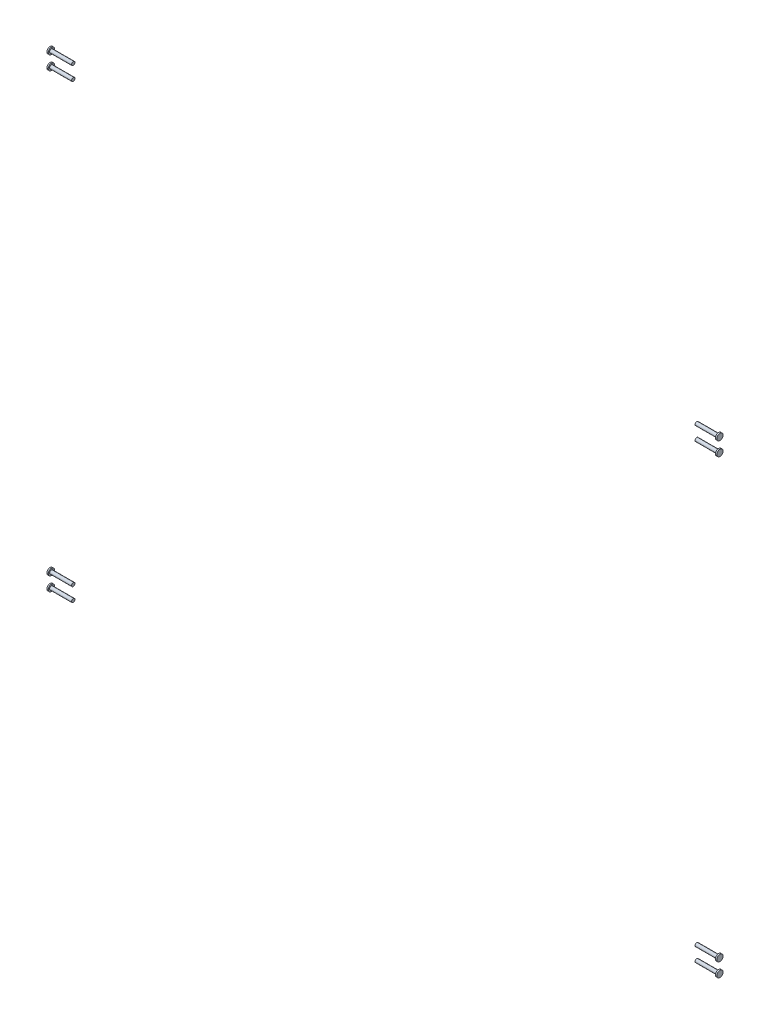
ISO-10303-21;
HEADER;
FILE_DESCRIPTION(('STEP AP214'),'2;1');
FILE_NAME('part.step','',(''),(''),'','','');
FILE_SCHEMA(('AUTOMOTIVE_DESIGN { 1 0 10303 214 1 1 1 1 }'));
ENDSEC;
DATA;
#1=APPLICATION_CONTEXT('core data for automotive mechanical design processes');
#2=APPLICATION_PROTOCOL_DEFINITION('international standard','automotive_design',2000,#1);
#3=PRODUCT_CONTEXT('',#1,'mechanical');
#4=PRODUCT('Part','Part','',(#3));
#5=PRODUCT_RELATED_PRODUCT_CATEGORY('part','',(#4));
#6=PRODUCT_DEFINITION_FORMATION('','',#4);
#7=PRODUCT_DEFINITION_CONTEXT('part definition',#1,'design');
#8=PRODUCT_DEFINITION('design','',#6,#7);
#9=PRODUCT_DEFINITION_SHAPE('','',#8);
#10=(LENGTH_UNIT() NAMED_UNIT(*) SI_UNIT(.MILLI.,.METRE.));
#11=(NAMED_UNIT(*) PLANE_ANGLE_UNIT() SI_UNIT($,.RADIAN.));
#12=(NAMED_UNIT(*) SI_UNIT($,.STERADIAN.) SOLID_ANGLE_UNIT());
#13=UNCERTAINTY_MEASURE_WITH_UNIT(LENGTH_MEASURE(1.E-05),#10,'distance_accuracy_value','');
#14=(GEOMETRIC_REPRESENTATION_CONTEXT(3) GLOBAL_UNCERTAINTY_ASSIGNED_CONTEXT((#13)) GLOBAL_UNIT_ASSIGNED_CONTEXT((#10,
#11,#12)) REPRESENTATION_CONTEXT('',''));
#15=CARTESIAN_POINT('',(0.,0.,0.));
#16=DIRECTION('',(0.,0.,1.));
#17=DIRECTION('',(1.,0.,0.));
#18=AXIS2_PLACEMENT_3D('',#15,#16,#17);
#19=CARTESIAN_POINT('',(-270.8,-202.,24.));
#20=DIRECTION('',(1.,0.,0.));
#21=DIRECTION('',(0.,0.,-1.));
#22=AXIS2_PLACEMENT_3D('',#19,#20,#21);
#23=PLANE('',#22);
#24=CARTESIAN_POINT('',(-270.8,-202.,24.));
#25=DIRECTION('',(-1.,0.,0.));
#26=DIRECTION('',(0.,0.,1.));
#27=AXIS2_PLACEMENT_3D('',#24,#25,#26);
#28=CIRCLE('',#27,1.5);
#29=CARTESIAN_POINT('',(-270.8,-202.,25.5));
#30=VERTEX_POINT('',#29);
#31=EDGE_CURVE('P0_E10',#30,#30,#28,.T.);
#32=ORIENTED_EDGE('',*,*,#31,.F.);
#33=EDGE_LOOP('',(#32));
#34=FACE_BOUND('',#33,.T.);
#35=ADVANCED_FACE('P0_F15',(#34),#23,.T.);
#36=CARTESIAN_POINT('',(-270.8,-202.,24.));
#37=DIRECTION('',(-1.,0.,0.));
#38=DIRECTION('',(0.,0.,1.));
#39=AXIS2_PLACEMENT_3D('',#36,#37,#38);
#40=CYLINDRICAL_SURFACE('',#39,1.5);
#41=CARTESIAN_POINT('',(-289.8,-202.,24.));
#42=DIRECTION('',(1.,0.,0.));
#43=DIRECTION('',(0.,0.,-1.));
#44=AXIS2_PLACEMENT_3D('',#41,#42,#43);
#45=CIRCLE('',#44,1.5);
#46=CARTESIAN_POINT('',(-289.8,-202.,22.5));
#47=VERTEX_POINT('',#46);
#48=EDGE_CURVE('P0_E23',#47,#47,#45,.F.);
#49=ORIENTED_EDGE('',*,*,#48,.F.);
#50=EDGE_LOOP('',(#49));
#51=FACE_BOUND('',#50,.T.);
#52=ORIENTED_EDGE('',*,*,#31,.T.);
#53=EDGE_LOOP('',(#52));
#54=FACE_BOUND('',#53,.T.);
#55=ADVANCED_FACE('P0_F17',(#51,#54),#40,.T.);
#56=CARTESIAN_POINT('',(-291.,-202.,24.));
#57=DIRECTION('',(-1.,0.,0.));
#58=DIRECTION('',(0.,0.,1.));
#59=AXIS2_PLACEMENT_3D('',#56,#57,#58);
#60=PLANE('',#59);
#61=CARTESIAN_POINT('',(-291.,-202.,24.));
#62=DIRECTION('',(1.,0.,0.));
#63=DIRECTION('',(0.,0.,-1.));
#64=AXIS2_PLACEMENT_3D('',#61,#62,#63);
#65=CIRCLE('',#64,2.75);
#66=CARTESIAN_POINT('',(-291.,-202.,21.25));
#67=VERTEX_POINT('',#66);
#68=EDGE_CURVE('P0_E30',#67,#67,#65,.T.);
#69=ORIENTED_EDGE('',*,*,#68,.F.);
#70=EDGE_LOOP('',(#69));
#71=FACE_BOUND('',#70,.T.);
#72=ADVANCED_FACE('P0_F45',(#71),#60,.T.);
#73=CARTESIAN_POINT('',(-289.8,-202.,24.));
#74=DIRECTION('',(1.,0.,0.));
#75=DIRECTION('',(0.,0.,-1.));
#76=AXIS2_PLACEMENT_3D('',#73,#74,#75);
#77=PLANE('',#76);
#78=ORIENTED_EDGE('',*,*,#48,.T.);
#79=EDGE_LOOP('',(#78));
#80=FACE_BOUND('',#79,.T.);
#81=CARTESIAN_POINT('',(-289.8,-202.,24.));
#82=DIRECTION('',(-1.,0.,0.));
#83=DIRECTION('',(0.,0.,1.));
#84=AXIS2_PLACEMENT_3D('',#81,#82,#83);
#85=CIRCLE('',#84,2.75);
#86=CARTESIAN_POINT('',(-289.8,-202.,26.75));
#87=VERTEX_POINT('',#86);
#88=EDGE_CURVE('P0_E35',#87,#87,#85,.T.);
#89=ORIENTED_EDGE('',*,*,#88,.F.);
#90=EDGE_LOOP('',(#89));
#91=FACE_BOUND('',#90,.T.);
#92=ADVANCED_FACE('P0_F43',(#80,#91),#77,.T.);
#93=CARTESIAN_POINT('',(-289.8,-202.,24.));
#94=DIRECTION('',(-1.,0.,0.));
#95=DIRECTION('',(0.,0.,1.));
#96=AXIS2_PLACEMENT_3D('',#93,#94,#95);
#97=CYLINDRICAL_SURFACE('',#96,2.75);
#98=ORIENTED_EDGE('',*,*,#68,.T.);
#99=EDGE_LOOP('',(#98));
#100=FACE_BOUND('',#99,.T.);
#101=ORIENTED_EDGE('',*,*,#88,.T.);
#102=EDGE_LOOP('',(#101));
#103=FACE_BOUND('',#102,.T.);
#104=ADVANCED_FACE('P0_F41',(#100,#103),#97,.T.);
#105=CLOSED_SHELL('',(#35,#55,#72,#92,#104));
#106=MANIFOLD_SOLID_BREP('P0_B1',#105);
#107=CARTESIAN_POINT('',(-270.8,-190.,24.));
#108=DIRECTION('',(1.,0.,0.));
#109=DIRECTION('',(0.,0.,-1.));
#110=AXIS2_PLACEMENT_3D('',#107,#108,#109);
#111=PLANE('',#110);
#112=CARTESIAN_POINT('',(-270.8,-190.,24.));
#113=DIRECTION('',(-1.,0.,0.));
#114=DIRECTION('',(0.,0.,1.));
#115=AXIS2_PLACEMENT_3D('',#112,#113,#114);
#116=CIRCLE('',#115,1.5);
#117=CARTESIAN_POINT('',(-270.8,-190.,25.5));
#118=VERTEX_POINT('',#117);
#119=EDGE_CURVE('P1_E10',#118,#118,#116,.T.);
#120=ORIENTED_EDGE('',*,*,#119,.F.);
#121=EDGE_LOOP('',(#120));
#122=FACE_BOUND('',#121,.T.);
#123=ADVANCED_FACE('P1_F15',(#122),#111,.T.);
#124=CARTESIAN_POINT('',(-270.8,-190.,24.));
#125=DIRECTION('',(-1.,0.,0.));
#126=DIRECTION('',(0.,0.,1.));
#127=AXIS2_PLACEMENT_3D('',#124,#125,#126);
#128=CYLINDRICAL_SURFACE('',#127,1.5);
#129=CARTESIAN_POINT('',(-289.8,-190.,24.));
#130=DIRECTION('',(1.,0.,0.));
#131=DIRECTION('',(0.,0.,-1.));
#132=AXIS2_PLACEMENT_3D('',#129,#130,#131);
#133=CIRCLE('',#132,1.5);
#134=CARTESIAN_POINT('',(-289.8,-190.,22.5));
#135=VERTEX_POINT('',#134);
#136=EDGE_CURVE('P1_E23',#135,#135,#133,.F.);
#137=ORIENTED_EDGE('',*,*,#136,.F.);
#138=EDGE_LOOP('',(#137));
#139=FACE_BOUND('',#138,.T.);
#140=ORIENTED_EDGE('',*,*,#119,.T.);
#141=EDGE_LOOP('',(#140));
#142=FACE_BOUND('',#141,.T.);
#143=ADVANCED_FACE('P1_F17',(#139,#142),#128,.T.);
#144=CARTESIAN_POINT('',(-291.,-190.,24.));
#145=DIRECTION('',(-1.,0.,0.));
#146=DIRECTION('',(0.,0.,1.));
#147=AXIS2_PLACEMENT_3D('',#144,#145,#146);
#148=PLANE('',#147);
#149=CARTESIAN_POINT('',(-291.,-190.,24.));
#150=DIRECTION('',(1.,0.,0.));
#151=DIRECTION('',(0.,0.,-1.));
#152=AXIS2_PLACEMENT_3D('',#149,#150,#151);
#153=CIRCLE('',#152,2.75);
#154=CARTESIAN_POINT('',(-291.,-190.,21.25));
#155=VERTEX_POINT('',#154);
#156=EDGE_CURVE('P1_E30',#155,#155,#153,.T.);
#157=ORIENTED_EDGE('',*,*,#156,.F.);
#158=EDGE_LOOP('',(#157));
#159=FACE_BOUND('',#158,.T.);
#160=ADVANCED_FACE('P1_F45',(#159),#148,.T.);
#161=CARTESIAN_POINT('',(-289.8,-190.,24.));
#162=DIRECTION('',(1.,0.,0.));
#163=DIRECTION('',(0.,0.,-1.));
#164=AXIS2_PLACEMENT_3D('',#161,#162,#163);
#165=PLANE('',#164);
#166=ORIENTED_EDGE('',*,*,#136,.T.);
#167=EDGE_LOOP('',(#166));
#168=FACE_BOUND('',#167,.T.);
#169=CARTESIAN_POINT('',(-289.8,-190.,24.));
#170=DIRECTION('',(-1.,0.,0.));
#171=DIRECTION('',(0.,0.,1.));
#172=AXIS2_PLACEMENT_3D('',#169,#170,#171);
#173=CIRCLE('',#172,2.75);
#174=CARTESIAN_POINT('',(-289.8,-190.,26.75));
#175=VERTEX_POINT('',#174);
#176=EDGE_CURVE('P1_E35',#175,#175,#173,.T.);
#177=ORIENTED_EDGE('',*,*,#176,.F.);
#178=EDGE_LOOP('',(#177));
#179=FACE_BOUND('',#178,.T.);
#180=ADVANCED_FACE('P1_F43',(#168,#179),#165,.T.);
#181=CARTESIAN_POINT('',(-289.8,-190.,24.));
#182=DIRECTION('',(-1.,0.,0.));
#183=DIRECTION('',(0.,0.,1.));
#184=AXIS2_PLACEMENT_3D('',#181,#182,#183);
#185=CYLINDRICAL_SURFACE('',#184,2.75);
#186=ORIENTED_EDGE('',*,*,#156,.T.);
#187=EDGE_LOOP('',(#186));
#188=FACE_BOUND('',#187,.T.);
#189=ORIENTED_EDGE('',*,*,#176,.T.);
#190=EDGE_LOOP('',(#189));
#191=FACE_BOUND('',#190,.T.);
#192=ADVANCED_FACE('P1_F41',(#188,#191),#185,.T.);
#193=CLOSED_SHELL('',(#123,#143,#160,#180,#192));
#194=MANIFOLD_SOLID_BREP('P1_B1',#193);
#195=CARTESIAN_POINT('',(-270.8,190.,24.));
#196=DIRECTION('',(1.,0.,0.));
#197=DIRECTION('',(0.,0.,-1.));
#198=AXIS2_PLACEMENT_3D('',#195,#196,#197);
#199=PLANE('',#198);
#200=CARTESIAN_POINT('',(-270.8,190.,24.));
#201=DIRECTION('',(-1.,0.,0.));
#202=DIRECTION('',(0.,0.,1.));
#203=AXIS2_PLACEMENT_3D('',#200,#201,#202);
#204=CIRCLE('',#203,1.5);
#205=CARTESIAN_POINT('',(-270.8,190.,25.5));
#206=VERTEX_POINT('',#205);
#207=EDGE_CURVE('P2_E10',#206,#206,#204,.T.);
#208=ORIENTED_EDGE('',*,*,#207,.F.);
#209=EDGE_LOOP('',(#208));
#210=FACE_BOUND('',#209,.T.);
#211=ADVANCED_FACE('P2_F15',(#210),#199,.T.);
#212=CARTESIAN_POINT('',(-270.8,190.,24.));
#213=DIRECTION('',(-1.,0.,0.));
#214=DIRECTION('',(0.,0.,1.));
#215=AXIS2_PLACEMENT_3D('',#212,#213,#214);
#216=CYLINDRICAL_SURFACE('',#215,1.5);
#217=CARTESIAN_POINT('',(-289.8,190.,24.));
#218=DIRECTION('',(1.,0.,0.));
#219=DIRECTION('',(0.,0.,-1.));
#220=AXIS2_PLACEMENT_3D('',#217,#218,#219);
#221=CIRCLE('',#220,1.5);
#222=CARTESIAN_POINT('',(-289.8,190.,22.5));
#223=VERTEX_POINT('',#222);
#224=EDGE_CURVE('P2_E23',#223,#223,#221,.F.);
#225=ORIENTED_EDGE('',*,*,#224,.F.);
#226=EDGE_LOOP('',(#225));
#227=FACE_BOUND('',#226,.T.);
#228=ORIENTED_EDGE('',*,*,#207,.T.);
#229=EDGE_LOOP('',(#228));
#230=FACE_BOUND('',#229,.T.);
#231=ADVANCED_FACE('P2_F17',(#227,#230),#216,.T.);
#232=CARTESIAN_POINT('',(-291.,190.,24.));
#233=DIRECTION('',(-1.,0.,0.));
#234=DIRECTION('',(0.,0.,1.));
#235=AXIS2_PLACEMENT_3D('',#232,#233,#234);
#236=PLANE('',#235);
#237=CARTESIAN_POINT('',(-291.,190.,24.));
#238=DIRECTION('',(1.,0.,0.));
#239=DIRECTION('',(0.,0.,-1.));
#240=AXIS2_PLACEMENT_3D('',#237,#238,#239);
#241=CIRCLE('',#240,2.75);
#242=CARTESIAN_POINT('',(-291.,190.,21.25));
#243=VERTEX_POINT('',#242);
#244=EDGE_CURVE('P2_E30',#243,#243,#241,.T.);
#245=ORIENTED_EDGE('',*,*,#244,.F.);
#246=EDGE_LOOP('',(#245));
#247=FACE_BOUND('',#246,.T.);
#248=ADVANCED_FACE('P2_F45',(#247),#236,.T.);
#249=CARTESIAN_POINT('',(-289.8,190.,24.));
#250=DIRECTION('',(1.,0.,0.));
#251=DIRECTION('',(0.,0.,-1.));
#252=AXIS2_PLACEMENT_3D('',#249,#250,#251);
#253=PLANE('',#252);
#254=ORIENTED_EDGE('',*,*,#224,.T.);
#255=EDGE_LOOP('',(#254));
#256=FACE_BOUND('',#255,.T.);
#257=CARTESIAN_POINT('',(-289.8,190.,24.));
#258=DIRECTION('',(-1.,0.,0.));
#259=DIRECTION('',(0.,0.,1.));
#260=AXIS2_PLACEMENT_3D('',#257,#258,#259);
#261=CIRCLE('',#260,2.75);
#262=CARTESIAN_POINT('',(-289.8,190.,26.75));
#263=VERTEX_POINT('',#262);
#264=EDGE_CURVE('P2_E35',#263,#263,#261,.T.);
#265=ORIENTED_EDGE('',*,*,#264,.F.);
#266=EDGE_LOOP('',(#265));
#267=FACE_BOUND('',#266,.T.);
#268=ADVANCED_FACE('P2_F43',(#256,#267),#253,.T.);
#269=CARTESIAN_POINT('',(-289.8,190.,24.));
#270=DIRECTION('',(-1.,0.,0.));
#271=DIRECTION('',(0.,0.,1.));
#272=AXIS2_PLACEMENT_3D('',#269,#270,#271);
#273=CYLINDRICAL_SURFACE('',#272,2.75);
#274=ORIENTED_EDGE('',*,*,#244,.T.);
#275=EDGE_LOOP('',(#274));
#276=FACE_BOUND('',#275,.T.);
#277=ORIENTED_EDGE('',*,*,#264,.T.);
#278=EDGE_LOOP('',(#277));
#279=FACE_BOUND('',#278,.T.);
#280=ADVANCED_FACE('P2_F41',(#276,#279),#273,.T.);
#281=CLOSED_SHELL('',(#211,#231,#248,#268,#280));
#282=MANIFOLD_SOLID_BREP('P2_B1',#281);
#283=CARTESIAN_POINT('',(-270.8,202.,24.));
#284=DIRECTION('',(1.,0.,0.));
#285=DIRECTION('',(0.,0.,-1.));
#286=AXIS2_PLACEMENT_3D('',#283,#284,#285);
#287=PLANE('',#286);
#288=CARTESIAN_POINT('',(-270.8,202.,24.));
#289=DIRECTION('',(-1.,0.,0.));
#290=DIRECTION('',(0.,0.,1.));
#291=AXIS2_PLACEMENT_3D('',#288,#289,#290);
#292=CIRCLE('',#291,1.5);
#293=CARTESIAN_POINT('',(-270.8,202.,25.5));
#294=VERTEX_POINT('',#293);
#295=EDGE_CURVE('P3_E10',#294,#294,#292,.T.);
#296=ORIENTED_EDGE('',*,*,#295,.F.);
#297=EDGE_LOOP('',(#296));
#298=FACE_BOUND('',#297,.T.);
#299=ADVANCED_FACE('P3_F15',(#298),#287,.T.);
#300=CARTESIAN_POINT('',(-270.8,202.,24.));
#301=DIRECTION('',(-1.,0.,0.));
#302=DIRECTION('',(0.,0.,1.));
#303=AXIS2_PLACEMENT_3D('',#300,#301,#302);
#304=CYLINDRICAL_SURFACE('',#303,1.5);
#305=CARTESIAN_POINT('',(-289.8,202.,24.));
#306=DIRECTION('',(1.,0.,0.));
#307=DIRECTION('',(0.,0.,-1.));
#308=AXIS2_PLACEMENT_3D('',#305,#306,#307);
#309=CIRCLE('',#308,1.5);
#310=CARTESIAN_POINT('',(-289.8,202.,22.5));
#311=VERTEX_POINT('',#310);
#312=EDGE_CURVE('P3_E23',#311,#311,#309,.F.);
#313=ORIENTED_EDGE('',*,*,#312,.F.);
#314=EDGE_LOOP('',(#313));
#315=FACE_BOUND('',#314,.T.);
#316=ORIENTED_EDGE('',*,*,#295,.T.);
#317=EDGE_LOOP('',(#316));
#318=FACE_BOUND('',#317,.T.);
#319=ADVANCED_FACE('P3_F17',(#315,#318),#304,.T.);
#320=CARTESIAN_POINT('',(-291.,202.,24.));
#321=DIRECTION('',(-1.,0.,0.));
#322=DIRECTION('',(0.,0.,1.));
#323=AXIS2_PLACEMENT_3D('',#320,#321,#322);
#324=PLANE('',#323);
#325=CARTESIAN_POINT('',(-291.,202.,24.));
#326=DIRECTION('',(1.,0.,0.));
#327=DIRECTION('',(0.,0.,-1.));
#328=AXIS2_PLACEMENT_3D('',#325,#326,#327);
#329=CIRCLE('',#328,2.75);
#330=CARTESIAN_POINT('',(-291.,202.,21.25));
#331=VERTEX_POINT('',#330);
#332=EDGE_CURVE('P3_E30',#331,#331,#329,.T.);
#333=ORIENTED_EDGE('',*,*,#332,.F.);
#334=EDGE_LOOP('',(#333));
#335=FACE_BOUND('',#334,.T.);
#336=ADVANCED_FACE('P3_F45',(#335),#324,.T.);
#337=CARTESIAN_POINT('',(-289.8,202.,24.));
#338=DIRECTION('',(1.,0.,0.));
#339=DIRECTION('',(0.,0.,-1.));
#340=AXIS2_PLACEMENT_3D('',#337,#338,#339);
#341=PLANE('',#340);
#342=ORIENTED_EDGE('',*,*,#312,.T.);
#343=EDGE_LOOP('',(#342));
#344=FACE_BOUND('',#343,.T.);
#345=CARTESIAN_POINT('',(-289.8,202.,24.));
#346=DIRECTION('',(-1.,0.,0.));
#347=DIRECTION('',(0.,0.,1.));
#348=AXIS2_PLACEMENT_3D('',#345,#346,#347);
#349=CIRCLE('',#348,2.75);
#350=CARTESIAN_POINT('',(-289.8,202.,26.75));
#351=VERTEX_POINT('',#350);
#352=EDGE_CURVE('P3_E35',#351,#351,#349,.T.);
#353=ORIENTED_EDGE('',*,*,#352,.F.);
#354=EDGE_LOOP('',(#353));
#355=FACE_BOUND('',#354,.T.);
#356=ADVANCED_FACE('P3_F43',(#344,#355),#341,.T.);
#357=CARTESIAN_POINT('',(-289.8,202.,24.));
#358=DIRECTION('',(-1.,0.,0.));
#359=DIRECTION('',(0.,0.,1.));
#360=AXIS2_PLACEMENT_3D('',#357,#358,#359);
#361=CYLINDRICAL_SURFACE('',#360,2.75);
#362=ORIENTED_EDGE('',*,*,#332,.T.);
#363=EDGE_LOOP('',(#362));
#364=FACE_BOUND('',#363,.T.);
#365=ORIENTED_EDGE('',*,*,#352,.T.);
#366=EDGE_LOOP('',(#365));
#367=FACE_BOUND('',#366,.T.);
#368=ADVANCED_FACE('P3_F41',(#364,#367),#361,.T.);
#369=CLOSED_SHELL('',(#299,#319,#336,#356,#368));
#370=MANIFOLD_SOLID_BREP('P3_B1',#369);
#371=CARTESIAN_POINT('',(270.8,-202.,24.));
#372=DIRECTION('',(-1.,0.,0.));
#373=DIRECTION('',(0.,0.,1.));
#374=AXIS2_PLACEMENT_3D('',#371,#372,#373);
#375=PLANE('',#374);
#376=CARTESIAN_POINT('',(270.8,-202.,24.));
#377=DIRECTION('',(1.,0.,0.));
#378=DIRECTION('',(0.,0.,-1.));
#379=AXIS2_PLACEMENT_3D('',#376,#377,#378);
#380=CIRCLE('',#379,1.5);
#381=CARTESIAN_POINT('',(270.8,-202.,22.5));
#382=VERTEX_POINT('',#381);
#383=EDGE_CURVE('P4_E10',#382,#382,#380,.T.);
#384=ORIENTED_EDGE('',*,*,#383,.F.);
#385=EDGE_LOOP('',(#384));
#386=FACE_BOUND('',#385,.T.);
#387=ADVANCED_FACE('P4_F15',(#386),#375,.T.);
#388=CARTESIAN_POINT('',(270.8,-202.,24.));
#389=DIRECTION('',(1.,0.,0.));
#390=DIRECTION('',(0.,0.,-1.));
#391=AXIS2_PLACEMENT_3D('',#388,#389,#390);
#392=CYLINDRICAL_SURFACE('',#391,1.5);
#393=CARTESIAN_POINT('',(289.8,-202.,24.));
#394=DIRECTION('',(-1.,0.,0.));
#395=DIRECTION('',(0.,0.,1.));
#396=AXIS2_PLACEMENT_3D('',#393,#394,#395);
#397=CIRCLE('',#396,1.5);
#398=CARTESIAN_POINT('',(289.8,-202.,25.5));
#399=VERTEX_POINT('',#398);
#400=EDGE_CURVE('P4_E23',#399,#399,#397,.F.);
#401=ORIENTED_EDGE('',*,*,#400,.F.);
#402=EDGE_LOOP('',(#401));
#403=FACE_BOUND('',#402,.T.);
#404=ORIENTED_EDGE('',*,*,#383,.T.);
#405=EDGE_LOOP('',(#404));
#406=FACE_BOUND('',#405,.T.);
#407=ADVANCED_FACE('P4_F17',(#403,#406),#392,.T.);
#408=CARTESIAN_POINT('',(291.,-202.,24.));
#409=DIRECTION('',(1.,0.,0.));
#410=DIRECTION('',(0.,0.,-1.));
#411=AXIS2_PLACEMENT_3D('',#408,#409,#410);
#412=PLANE('',#411);
#413=CARTESIAN_POINT('',(291.,-202.,24.));
#414=DIRECTION('',(-1.,0.,0.));
#415=DIRECTION('',(0.,0.,1.));
#416=AXIS2_PLACEMENT_3D('',#413,#414,#415);
#417=CIRCLE('',#416,2.75);
#418=CARTESIAN_POINT('',(291.,-202.,26.75));
#419=VERTEX_POINT('',#418);
#420=EDGE_CURVE('P4_E31',#419,#419,#417,.T.);
#421=ORIENTED_EDGE('',*,*,#420,.F.);
#422=EDGE_LOOP('',(#421));
#423=FACE_BOUND('',#422,.T.);
#424=ADVANCED_FACE('P4_F45',(#423),#412,.T.);
#425=CARTESIAN_POINT('',(289.8,-202.,24.));
#426=DIRECTION('',(-1.,0.,0.));
#427=DIRECTION('',(0.,0.,1.));
#428=AXIS2_PLACEMENT_3D('',#425,#426,#427);
#429=PLANE('',#428);
#430=ORIENTED_EDGE('',*,*,#400,.T.);
#431=EDGE_LOOP('',(#430));
#432=FACE_BOUND('',#431,.T.);
#433=CARTESIAN_POINT('',(289.8,-202.,24.));
#434=DIRECTION('',(1.,0.,0.));
#435=DIRECTION('',(0.,0.,-1.));
#436=AXIS2_PLACEMENT_3D('',#433,#434,#435);
#437=CIRCLE('',#436,2.75);
#438=CARTESIAN_POINT('',(289.8,-202.,21.25));
#439=VERTEX_POINT('',#438);
#440=EDGE_CURVE('P4_E35',#439,#439,#437,.T.);
#441=ORIENTED_EDGE('',*,*,#440,.F.);
#442=EDGE_LOOP('',(#441));
#443=FACE_BOUND('',#442,.T.);
#444=ADVANCED_FACE('P4_F43',(#432,#443),#429,.T.);
#445=CARTESIAN_POINT('',(289.8,-202.,24.));
#446=DIRECTION('',(1.,0.,0.));
#447=DIRECTION('',(0.,0.,-1.));
#448=AXIS2_PLACEMENT_3D('',#445,#446,#447);
#449=CYLINDRICAL_SURFACE('',#448,2.75);
#450=ORIENTED_EDGE('',*,*,#420,.T.);
#451=EDGE_LOOP('',(#450));
#452=FACE_BOUND('',#451,.T.);
#453=ORIENTED_EDGE('',*,*,#440,.T.);
#454=EDGE_LOOP('',(#453));
#455=FACE_BOUND('',#454,.T.);
#456=ADVANCED_FACE('P4_F41',(#452,#455),#449,.T.);
#457=CLOSED_SHELL('',(#387,#407,#424,#444,#456));
#458=MANIFOLD_SOLID_BREP('P4_B1',#457);
#459=CARTESIAN_POINT('',(270.8,-190.,24.));
#460=DIRECTION('',(-1.,0.,0.));
#461=DIRECTION('',(0.,0.,1.));
#462=AXIS2_PLACEMENT_3D('',#459,#460,#461);
#463=PLANE('',#462);
#464=CARTESIAN_POINT('',(270.8,-190.,24.));
#465=DIRECTION('',(1.,0.,0.));
#466=DIRECTION('',(0.,0.,-1.));
#467=AXIS2_PLACEMENT_3D('',#464,#465,#466);
#468=CIRCLE('',#467,1.5);
#469=CARTESIAN_POINT('',(270.8,-190.,22.5));
#470=VERTEX_POINT('',#469);
#471=EDGE_CURVE('P5_E10',#470,#470,#468,.T.);
#472=ORIENTED_EDGE('',*,*,#471,.F.);
#473=EDGE_LOOP('',(#472));
#474=FACE_BOUND('',#473,.T.);
#475=ADVANCED_FACE('P5_F15',(#474),#463,.T.);
#476=CARTESIAN_POINT('',(270.8,-190.,24.));
#477=DIRECTION('',(1.,0.,0.));
#478=DIRECTION('',(0.,0.,-1.));
#479=AXIS2_PLACEMENT_3D('',#476,#477,#478);
#480=CYLINDRICAL_SURFACE('',#479,1.5);
#481=CARTESIAN_POINT('',(289.8,-190.,24.));
#482=DIRECTION('',(-1.,0.,0.));
#483=DIRECTION('',(0.,0.,1.));
#484=AXIS2_PLACEMENT_3D('',#481,#482,#483);
#485=CIRCLE('',#484,1.5);
#486=CARTESIAN_POINT('',(289.8,-190.,25.5));
#487=VERTEX_POINT('',#486);
#488=EDGE_CURVE('P5_E23',#487,#487,#485,.F.);
#489=ORIENTED_EDGE('',*,*,#488,.F.);
#490=EDGE_LOOP('',(#489));
#491=FACE_BOUND('',#490,.T.);
#492=ORIENTED_EDGE('',*,*,#471,.T.);
#493=EDGE_LOOP('',(#492));
#494=FACE_BOUND('',#493,.T.);
#495=ADVANCED_FACE('P5_F17',(#491,#494),#480,.T.);
#496=CARTESIAN_POINT('',(291.,-190.,24.));
#497=DIRECTION('',(1.,0.,0.));
#498=DIRECTION('',(0.,0.,-1.));
#499=AXIS2_PLACEMENT_3D('',#496,#497,#498);
#500=PLANE('',#499);
#501=CARTESIAN_POINT('',(291.,-190.,24.));
#502=DIRECTION('',(-1.,0.,0.));
#503=DIRECTION('',(0.,0.,1.));
#504=AXIS2_PLACEMENT_3D('',#501,#502,#503);
#505=CIRCLE('',#504,2.75);
#506=CARTESIAN_POINT('',(291.,-190.,26.75));
#507=VERTEX_POINT('',#506);
#508=EDGE_CURVE('P5_E31',#507,#507,#505,.T.);
#509=ORIENTED_EDGE('',*,*,#508,.F.);
#510=EDGE_LOOP('',(#509));
#511=FACE_BOUND('',#510,.T.);
#512=ADVANCED_FACE('P5_F45',(#511),#500,.T.);
#513=CARTESIAN_POINT('',(289.8,-190.,24.));
#514=DIRECTION('',(-1.,0.,0.));
#515=DIRECTION('',(0.,0.,1.));
#516=AXIS2_PLACEMENT_3D('',#513,#514,#515);
#517=PLANE('',#516);
#518=ORIENTED_EDGE('',*,*,#488,.T.);
#519=EDGE_LOOP('',(#518));
#520=FACE_BOUND('',#519,.T.);
#521=CARTESIAN_POINT('',(289.8,-190.,24.));
#522=DIRECTION('',(1.,0.,0.));
#523=DIRECTION('',(0.,0.,-1.));
#524=AXIS2_PLACEMENT_3D('',#521,#522,#523);
#525=CIRCLE('',#524,2.75);
#526=CARTESIAN_POINT('',(289.8,-190.,21.25));
#527=VERTEX_POINT('',#526);
#528=EDGE_CURVE('P5_E35',#527,#527,#525,.T.);
#529=ORIENTED_EDGE('',*,*,#528,.F.);
#530=EDGE_LOOP('',(#529));
#531=FACE_BOUND('',#530,.T.);
#532=ADVANCED_FACE('P5_F43',(#520,#531),#517,.T.);
#533=CARTESIAN_POINT('',(289.8,-190.,24.));
#534=DIRECTION('',(1.,0.,0.));
#535=DIRECTION('',(0.,0.,-1.));
#536=AXIS2_PLACEMENT_3D('',#533,#534,#535);
#537=CYLINDRICAL_SURFACE('',#536,2.75);
#538=ORIENTED_EDGE('',*,*,#508,.T.);
#539=EDGE_LOOP('',(#538));
#540=FACE_BOUND('',#539,.T.);
#541=ORIENTED_EDGE('',*,*,#528,.T.);
#542=EDGE_LOOP('',(#541));
#543=FACE_BOUND('',#542,.T.);
#544=ADVANCED_FACE('P5_F41',(#540,#543),#537,.T.);
#545=CLOSED_SHELL('',(#475,#495,#512,#532,#544));
#546=MANIFOLD_SOLID_BREP('P5_B1',#545);
#547=CARTESIAN_POINT('',(270.8,190.,24.));
#548=DIRECTION('',(-1.,0.,0.));
#549=DIRECTION('',(0.,0.,1.));
#550=AXIS2_PLACEMENT_3D('',#547,#548,#549);
#551=PLANE('',#550);
#552=CARTESIAN_POINT('',(270.8,190.,24.));
#553=DIRECTION('',(1.,0.,0.));
#554=DIRECTION('',(0.,0.,-1.));
#555=AXIS2_PLACEMENT_3D('',#552,#553,#554);
#556=CIRCLE('',#555,1.5);
#557=CARTESIAN_POINT('',(270.8,190.,22.5));
#558=VERTEX_POINT('',#557);
#559=EDGE_CURVE('P6_E10',#558,#558,#556,.T.);
#560=ORIENTED_EDGE('',*,*,#559,.F.);
#561=EDGE_LOOP('',(#560));
#562=FACE_BOUND('',#561,.T.);
#563=ADVANCED_FACE('P6_F15',(#562),#551,.T.);
#564=CARTESIAN_POINT('',(270.8,190.,24.));
#565=DIRECTION('',(1.,0.,0.));
#566=DIRECTION('',(0.,0.,-1.));
#567=AXIS2_PLACEMENT_3D('',#564,#565,#566);
#568=CYLINDRICAL_SURFACE('',#567,1.5);
#569=CARTESIAN_POINT('',(289.8,190.,24.));
#570=DIRECTION('',(-1.,0.,0.));
#571=DIRECTION('',(0.,0.,1.));
#572=AXIS2_PLACEMENT_3D('',#569,#570,#571);
#573=CIRCLE('',#572,1.5);
#574=CARTESIAN_POINT('',(289.8,190.,25.5));
#575=VERTEX_POINT('',#574);
#576=EDGE_CURVE('P6_E23',#575,#575,#573,.F.);
#577=ORIENTED_EDGE('',*,*,#576,.F.);
#578=EDGE_LOOP('',(#577));
#579=FACE_BOUND('',#578,.T.);
#580=ORIENTED_EDGE('',*,*,#559,.T.);
#581=EDGE_LOOP('',(#580));
#582=FACE_BOUND('',#581,.T.);
#583=ADVANCED_FACE('P6_F17',(#579,#582),#568,.T.);
#584=CARTESIAN_POINT('',(291.,190.,24.));
#585=DIRECTION('',(1.,0.,0.));
#586=DIRECTION('',(0.,0.,-1.));
#587=AXIS2_PLACEMENT_3D('',#584,#585,#586);
#588=PLANE('',#587);
#589=CARTESIAN_POINT('',(291.,190.,24.));
#590=DIRECTION('',(-1.,0.,0.));
#591=DIRECTION('',(0.,0.,1.));
#592=AXIS2_PLACEMENT_3D('',#589,#590,#591);
#593=CIRCLE('',#592,2.75);
#594=CARTESIAN_POINT('',(291.,190.,26.75));
#595=VERTEX_POINT('',#594);
#596=EDGE_CURVE('P6_E30',#595,#595,#593,.T.);
#597=ORIENTED_EDGE('',*,*,#596,.F.);
#598=EDGE_LOOP('',(#597));
#599=FACE_BOUND('',#598,.T.);
#600=ADVANCED_FACE('P6_F45',(#599),#588,.T.);
#601=CARTESIAN_POINT('',(289.8,190.,24.));
#602=DIRECTION('',(-1.,0.,0.));
#603=DIRECTION('',(0.,0.,1.));
#604=AXIS2_PLACEMENT_3D('',#601,#602,#603);
#605=PLANE('',#604);
#606=ORIENTED_EDGE('',*,*,#576,.T.);
#607=EDGE_LOOP('',(#606));
#608=FACE_BOUND('',#607,.T.);
#609=CARTESIAN_POINT('',(289.8,190.,24.));
#610=DIRECTION('',(1.,0.,0.));
#611=DIRECTION('',(0.,0.,-1.));
#612=AXIS2_PLACEMENT_3D('',#609,#610,#611);
#613=CIRCLE('',#612,2.75);
#614=CARTESIAN_POINT('',(289.8,190.,21.25));
#615=VERTEX_POINT('',#614);
#616=EDGE_CURVE('P6_E35',#615,#615,#613,.T.);
#617=ORIENTED_EDGE('',*,*,#616,.F.);
#618=EDGE_LOOP('',(#617));
#619=FACE_BOUND('',#618,.T.);
#620=ADVANCED_FACE('P6_F43',(#608,#619),#605,.T.);
#621=CARTESIAN_POINT('',(289.8,190.,24.));
#622=DIRECTION('',(1.,0.,0.));
#623=DIRECTION('',(0.,0.,-1.));
#624=AXIS2_PLACEMENT_3D('',#621,#622,#623);
#625=CYLINDRICAL_SURFACE('',#624,2.75);
#626=ORIENTED_EDGE('',*,*,#596,.T.);
#627=EDGE_LOOP('',(#626));
#628=FACE_BOUND('',#627,.T.);
#629=ORIENTED_EDGE('',*,*,#616,.T.);
#630=EDGE_LOOP('',(#629));
#631=FACE_BOUND('',#630,.T.);
#632=ADVANCED_FACE('P6_F41',(#628,#631),#625,.T.);
#633=CLOSED_SHELL('',(#563,#583,#600,#620,#632));
#634=MANIFOLD_SOLID_BREP('P6_B1',#633);
#635=CARTESIAN_POINT('',(270.8,202.,24.));
#636=DIRECTION('',(-1.,0.,0.));
#637=DIRECTION('',(0.,0.,1.));
#638=AXIS2_PLACEMENT_3D('',#635,#636,#637);
#639=PLANE('',#638);
#640=CARTESIAN_POINT('',(270.8,202.,24.));
#641=DIRECTION('',(1.,0.,0.));
#642=DIRECTION('',(0.,0.,-1.));
#643=AXIS2_PLACEMENT_3D('',#640,#641,#642);
#644=CIRCLE('',#643,1.5);
#645=CARTESIAN_POINT('',(270.8,202.,22.5));
#646=VERTEX_POINT('',#645);
#647=EDGE_CURVE('P7_E10',#646,#646,#644,.T.);
#648=ORIENTED_EDGE('',*,*,#647,.F.);
#649=EDGE_LOOP('',(#648));
#650=FACE_BOUND('',#649,.T.);
#651=ADVANCED_FACE('P7_F15',(#650),#639,.T.);
#652=CARTESIAN_POINT('',(270.8,202.,24.));
#653=DIRECTION('',(1.,0.,0.));
#654=DIRECTION('',(0.,0.,-1.));
#655=AXIS2_PLACEMENT_3D('',#652,#653,#654);
#656=CYLINDRICAL_SURFACE('',#655,1.5);
#657=CARTESIAN_POINT('',(289.8,202.,24.));
#658=DIRECTION('',(-1.,0.,0.));
#659=DIRECTION('',(0.,0.,1.));
#660=AXIS2_PLACEMENT_3D('',#657,#658,#659);
#661=CIRCLE('',#660,1.5);
#662=CARTESIAN_POINT('',(289.8,202.,25.5));
#663=VERTEX_POINT('',#662);
#664=EDGE_CURVE('P7_E23',#663,#663,#661,.F.);
#665=ORIENTED_EDGE('',*,*,#664,.F.);
#666=EDGE_LOOP('',(#665));
#667=FACE_BOUND('',#666,.T.);
#668=ORIENTED_EDGE('',*,*,#647,.T.);
#669=EDGE_LOOP('',(#668));
#670=FACE_BOUND('',#669,.T.);
#671=ADVANCED_FACE('P7_F17',(#667,#670),#656,.T.);
#672=CARTESIAN_POINT('',(291.,202.,24.));
#673=DIRECTION('',(1.,0.,0.));
#674=DIRECTION('',(0.,0.,-1.));
#675=AXIS2_PLACEMENT_3D('',#672,#673,#674);
#676=PLANE('',#675);
#677=CARTESIAN_POINT('',(291.,202.,24.));
#678=DIRECTION('',(-1.,0.,0.));
#679=DIRECTION('',(0.,0.,1.));
#680=AXIS2_PLACEMENT_3D('',#677,#678,#679);
#681=CIRCLE('',#680,2.75);
#682=CARTESIAN_POINT('',(291.,202.,26.75));
#683=VERTEX_POINT('',#682);
#684=EDGE_CURVE('P7_E30',#683,#683,#681,.T.);
#685=ORIENTED_EDGE('',*,*,#684,.F.);
#686=EDGE_LOOP('',(#685));
#687=FACE_BOUND('',#686,.T.);
#688=ADVANCED_FACE('P7_F45',(#687),#676,.T.);
#689=CARTESIAN_POINT('',(289.8,202.,24.));
#690=DIRECTION('',(-1.,0.,0.));
#691=DIRECTION('',(0.,0.,1.));
#692=AXIS2_PLACEMENT_3D('',#689,#690,#691);
#693=PLANE('',#692);
#694=ORIENTED_EDGE('',*,*,#664,.T.);
#695=EDGE_LOOP('',(#694));
#696=FACE_BOUND('',#695,.T.);
#697=CARTESIAN_POINT('',(289.8,202.,24.));
#698=DIRECTION('',(1.,0.,0.));
#699=DIRECTION('',(0.,0.,-1.));
#700=AXIS2_PLACEMENT_3D('',#697,#698,#699);
#701=CIRCLE('',#700,2.75);
#702=CARTESIAN_POINT('',(289.8,202.,21.25));
#703=VERTEX_POINT('',#702);
#704=EDGE_CURVE('P7_E35',#703,#703,#701,.T.);
#705=ORIENTED_EDGE('',*,*,#704,.F.);
#706=EDGE_LOOP('',(#705));
#707=FACE_BOUND('',#706,.T.);
#708=ADVANCED_FACE('P7_F43',(#696,#707),#693,.T.);
#709=CARTESIAN_POINT('',(289.8,202.,24.));
#710=DIRECTION('',(1.,0.,0.));
#711=DIRECTION('',(0.,0.,-1.));
#712=AXIS2_PLACEMENT_3D('',#709,#710,#711);
#713=CYLINDRICAL_SURFACE('',#712,2.75);
#714=ORIENTED_EDGE('',*,*,#684,.T.);
#715=EDGE_LOOP('',(#714));
#716=FACE_BOUND('',#715,.T.);
#717=ORIENTED_EDGE('',*,*,#704,.T.);
#718=EDGE_LOOP('',(#717));
#719=FACE_BOUND('',#718,.T.);
#720=ADVANCED_FACE('P7_F41',(#716,#719),#713,.T.);
#721=CLOSED_SHELL('',(#651,#671,#688,#708,#720));
#722=MANIFOLD_SOLID_BREP('P7_B1',#721);
#723=ADVANCED_BREP_SHAPE_REPRESENTATION('',(#18,#106,#194,#282,#370,#458,#546,#634,#722),#14);
#724=SHAPE_DEFINITION_REPRESENTATION(#9,#723);
ENDSEC;
END-ISO-10303-21;
